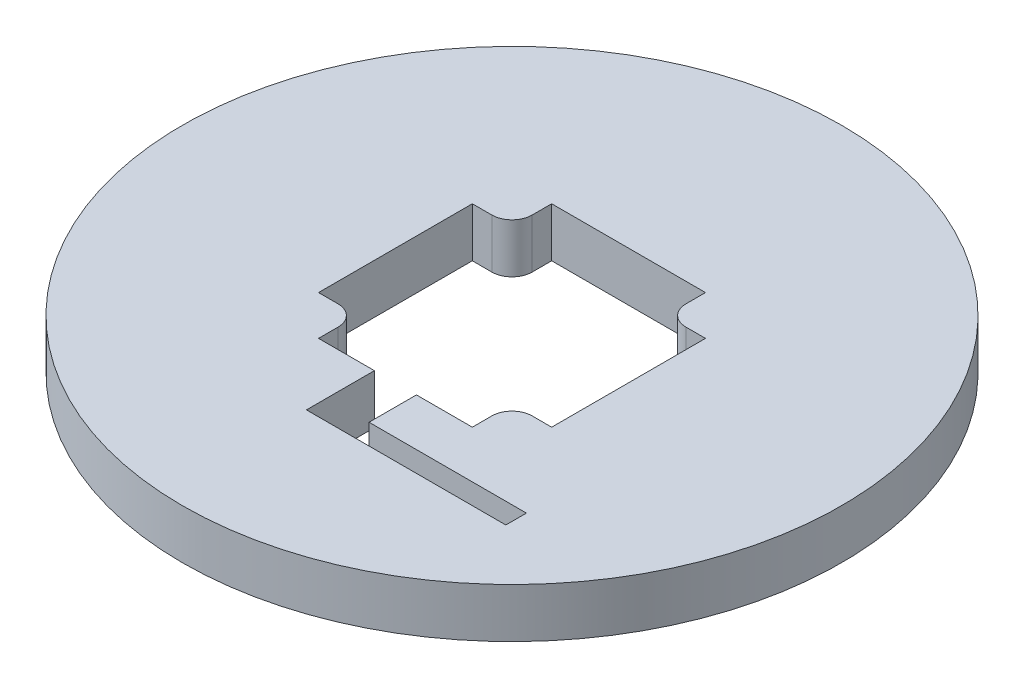
ISO-10303-21;
HEADER;
FILE_DESCRIPTION(('STEP AP214'),'2;1');
FILE_NAME('part.step','',(''),(''),'','','');
FILE_SCHEMA(('AUTOMOTIVE_DESIGN { 1 0 10303 214 1 1 1 1 }'));
ENDSEC;
DATA;
#1=APPLICATION_CONTEXT('core data for automotive mechanical design processes');
#2=APPLICATION_PROTOCOL_DEFINITION('international standard','automotive_design',2000,#1);
#3=PRODUCT_CONTEXT('',#1,'mechanical');
#4=PRODUCT('Part','Part','',(#3));
#5=PRODUCT_RELATED_PRODUCT_CATEGORY('part','',(#4));
#6=PRODUCT_DEFINITION_FORMATION('','',#4);
#7=PRODUCT_DEFINITION_CONTEXT('part definition',#1,'design');
#8=PRODUCT_DEFINITION('design','',#6,#7);
#9=PRODUCT_DEFINITION_SHAPE('','',#8);
#10=(LENGTH_UNIT() NAMED_UNIT(*) SI_UNIT(.MILLI.,.METRE.));
#11=(NAMED_UNIT(*) PLANE_ANGLE_UNIT() SI_UNIT($,.RADIAN.));
#12=(NAMED_UNIT(*) SI_UNIT($,.STERADIAN.) SOLID_ANGLE_UNIT());
#13=UNCERTAINTY_MEASURE_WITH_UNIT(LENGTH_MEASURE(1.E-05),#10,'distance_accuracy_value','');
#14=(GEOMETRIC_REPRESENTATION_CONTEXT(3) GLOBAL_UNCERTAINTY_ASSIGNED_CONTEXT((#13)) GLOBAL_UNIT_ASSIGNED_CONTEXT((#10,
#11,#12)) REPRESENTATION_CONTEXT('',''));
#15=CARTESIAN_POINT('',(0.,0.,0.));
#16=DIRECTION('',(0.,0.,1.));
#17=DIRECTION('',(1.,0.,0.));
#18=AXIS2_PLACEMENT_3D('',#15,#16,#17);
#19=CARTESIAN_POINT('',(-5.1,12.,29.8));
#20=DIRECTION('',(1.,0.,0.));
#21=DIRECTION('',(0.,0.,-1.));
#22=AXIS2_PLACEMENT_3D('',#19,#20,#21);
#23=PLANE('',#22);
#24=DIRECTION('',(0.,0.,1.));
#25=VECTOR('',#24,1.);
#26=CARTESIAN_POINT('',(-5.1,0.,29.8));
#27=LINE('',#26,#25);
#28=CARTESIAN_POINT('',(-5.1,0.,28.3));
#29=VERTEX_POINT('',#28);
#30=CARTESIAN_POINT('',(-5.1,0.,44.8));
#31=VERTEX_POINT('',#30);
#32=EDGE_CURVE('E129',#29,#31,#27,.T.);
#33=ORIENTED_EDGE('',*,*,#32,.F.);
#34=DIRECTION('',(0.,-1.,0.));
#35=VECTOR('',#34,1.);
#36=CARTESIAN_POINT('',(-5.1,12.,28.3));
#37=LINE('',#36,#35);
#38=CARTESIAN_POINT('',(-5.1,12.,28.3));
#39=VERTEX_POINT('',#38);
#40=EDGE_CURVE('E11',#39,#29,#37,.T.);
#41=ORIENTED_EDGE('',*,*,#40,.F.);
#42=DIRECTION('',(0.,0.,1.));
#43=VECTOR('',#42,1.);
#44=CARTESIAN_POINT('',(-5.1,12.,29.8));
#45=LINE('',#44,#43);
#46=CARTESIAN_POINT('',(-5.1,12.,44.8));
#47=VERTEX_POINT('',#46);
#48=EDGE_CURVE('E221',#39,#47,#45,.T.);
#49=ORIENTED_EDGE('',*,*,#48,.T.);
#50=DIRECTION('',(0.,-1.,0.));
#51=VECTOR('',#50,1.);
#52=CARTESIAN_POINT('',(-5.1,238.274169979695,44.8));
#53=LINE('',#52,#51);
#54=EDGE_CURVE('E372',#47,#31,#53,.T.);
#55=ORIENTED_EDGE('',*,*,#54,.T.);
#56=EDGE_LOOP('',(#33,#41,#49,#55));
#57=FACE_BOUND('',#56,.T.);
#58=ADVANCED_FACE('F44',(#57),#23,.T.);
#59=CARTESIAN_POINT('',(-5.1,12.,28.3));
#60=DIRECTION('',(0.,0.,-1.));
#61=DIRECTION('',(-1.,0.,0.));
#62=AXIS2_PLACEMENT_3D('',#59,#60,#61);
#63=PLANE('',#62);
#64=DIRECTION('',(1.,0.,0.));
#65=VECTOR('',#64,1.);
#66=CARTESIAN_POINT('',(-5.1,0.,28.3));
#67=LINE('',#66,#65);
#68=CARTESIAN_POINT('',(-18.67,0.,28.3));
#69=VERTEX_POINT('',#68);
#70=EDGE_CURVE('E294',#69,#29,#67,.T.);
#71=ORIENTED_EDGE('',*,*,#70,.F.);
#72=DIRECTION('',(0.,-1.,0.));
#73=VECTOR('',#72,1.);
#74=CARTESIAN_POINT('',(-18.67,12.,28.3));
#75=LINE('',#74,#73);
#76=CARTESIAN_POINT('',(-18.67,12.,28.3));
#77=VERTEX_POINT('',#76);
#78=EDGE_CURVE('E55',#77,#69,#75,.T.);
#79=ORIENTED_EDGE('',*,*,#78,.F.);
#80=DIRECTION('',(1.,0.,0.));
#81=VECTOR('',#80,1.);
#82=CARTESIAN_POINT('',(-5.1,12.,28.3));
#83=LINE('',#82,#81);
#84=EDGE_CURVE('E207',#77,#39,#83,.T.);
#85=ORIENTED_EDGE('',*,*,#84,.T.);
#86=ORIENTED_EDGE('',*,*,#40,.T.);
#87=EDGE_LOOP('',(#71,#79,#85,#86));
#88=FACE_BOUND('',#87,.T.);
#89=ADVANCED_FACE('F508',(#88),#63,.T.);
#90=CARTESIAN_POINT('',(-18.67,12.,28.3));
#91=DIRECTION('',(1.,0.,0.));
#92=DIRECTION('',(0.,0.,-1.));
#93=AXIS2_PLACEMENT_3D('',#90,#91,#92);
#94=PLANE('',#93);
#95=DIRECTION('',(0.,0.,1.));
#96=VECTOR('',#95,1.);
#97=CARTESIAN_POINT('',(-18.67,0.,28.3));
#98=LINE('',#97,#96);
#99=CARTESIAN_POINT('',(-18.67,0.,23.57));
#100=VERTEX_POINT('',#99);
#101=EDGE_CURVE('E189',#100,#69,#98,.T.);
#102=ORIENTED_EDGE('',*,*,#101,.F.);
#103=DIRECTION('',(0.,-1.,0.));
#104=VECTOR('',#103,1.);
#105=CARTESIAN_POINT('',(-18.67,12.,23.57));
#106=LINE('',#105,#104);
#107=CARTESIAN_POINT('',(-18.67,12.,23.57));
#108=VERTEX_POINT('',#107);
#109=EDGE_CURVE('E184',#108,#100,#106,.T.);
#110=ORIENTED_EDGE('',*,*,#109,.F.);
#111=DIRECTION('',(0.,0.,1.));
#112=VECTOR('',#111,1.);
#113=CARTESIAN_POINT('',(-18.67,12.,28.3));
#114=LINE('',#113,#112);
#115=EDGE_CURVE('E187',#108,#77,#114,.T.);
#116=ORIENTED_EDGE('',*,*,#115,.T.);
#117=ORIENTED_EDGE('',*,*,#78,.T.);
#118=EDGE_LOOP('',(#102,#110,#116,#117));
#119=FACE_BOUND('',#118,.T.);
#120=ADVANCED_FACE('F186',(#119),#94,.T.);
#121=CARTESIAN_POINT('',(-23.57,12.,23.57));
#122=DIRECTION('',(0.,-1.,0.));
#123=DIRECTION('',(0.,0.,-1.));
#124=AXIS2_PLACEMENT_3D('',#121,#122,#123);
#125=CYLINDRICAL_SURFACE('',#124,4.9);
#126=CARTESIAN_POINT('',(-23.57,0.,23.57));
#127=DIRECTION('',(0.,-1.,0.));
#128=DIRECTION('',(0.,0.,-1.));
#129=AXIS2_PLACEMENT_3D('',#126,#127,#128);
#130=CIRCLE('',#129,4.9);
#131=CARTESIAN_POINT('',(-23.57,0.,18.67));
#132=VERTEX_POINT('',#131);
#133=EDGE_CURVE('E289',#132,#100,#130,.T.);
#134=ORIENTED_EDGE('',*,*,#133,.F.);
#135=DIRECTION('',(0.,-1.,0.));
#136=VECTOR('',#135,1.);
#137=CARTESIAN_POINT('',(-23.57,12.,18.67));
#138=LINE('',#137,#136);
#139=CARTESIAN_POINT('',(-23.57,12.,18.67));
#140=VERTEX_POINT('',#139);
#141=EDGE_CURVE('E195',#140,#132,#138,.T.);
#142=ORIENTED_EDGE('',*,*,#141,.F.);
#143=CARTESIAN_POINT('',(-23.57,12.,23.57));
#144=DIRECTION('',(0.,-1.,0.));
#145=DIRECTION('',(0.,0.,-1.));
#146=AXIS2_PLACEMENT_3D('',#143,#144,#145);
#147=CIRCLE('',#146,4.9);
#148=EDGE_CURVE('E204',#140,#108,#147,.T.);
#149=ORIENTED_EDGE('',*,*,#148,.T.);
#150=ORIENTED_EDGE('',*,*,#109,.T.);
#151=EDGE_LOOP('',(#134,#142,#149,#150));
#152=FACE_BOUND('',#151,.T.);
#153=ADVANCED_FACE('F210',(#152),#125,.T.);
#154=CARTESIAN_POINT('',(-23.57,12.,18.67));
#155=DIRECTION('',(0.,0.,-1.));
#156=DIRECTION('',(-1.,0.,0.));
#157=AXIS2_PLACEMENT_3D('',#154,#155,#156);
#158=PLANE('',#157);
#159=DIRECTION('',(1.,0.,0.));
#160=VECTOR('',#159,1.);
#161=CARTESIAN_POINT('',(-23.57,0.,18.67));
#162=LINE('',#161,#160);
#163=CARTESIAN_POINT('',(-28.3,0.,18.67));
#164=VERTEX_POINT('',#163);
#165=EDGE_CURVE('E285',#164,#132,#162,.T.);
#166=ORIENTED_EDGE('',*,*,#165,.F.);
#167=DIRECTION('',(0.,-1.,0.));
#168=VECTOR('',#167,1.);
#169=CARTESIAN_POINT('',(-28.3,12.,18.67));
#170=LINE('',#169,#168);
#171=CARTESIAN_POINT('',(-28.3,12.,18.67));
#172=VERTEX_POINT('',#171);
#173=EDGE_CURVE('E305',#172,#164,#170,.T.);
#174=ORIENTED_EDGE('',*,*,#173,.F.);
#175=DIRECTION('',(1.,0.,0.));
#176=VECTOR('',#175,1.);
#177=CARTESIAN_POINT('',(-23.57,12.,18.67));
#178=LINE('',#177,#176);
#179=EDGE_CURVE('E212',#172,#140,#178,.T.);
#180=ORIENTED_EDGE('',*,*,#179,.T.);
#181=ORIENTED_EDGE('',*,*,#141,.T.);
#182=EDGE_LOOP('',(#166,#174,#180,#181));
#183=FACE_BOUND('',#182,.T.);
#184=ADVANCED_FACE('F522',(#183),#158,.T.);
#185=CARTESIAN_POINT('',(-28.3,12.,18.67));
#186=DIRECTION('',(1.,0.,0.));
#187=DIRECTION('',(0.,0.,-1.));
#188=AXIS2_PLACEMENT_3D('',#185,#186,#187);
#189=PLANE('',#188);
#190=DIRECTION('',(0.,0.,1.));
#191=VECTOR('',#190,1.);
#192=CARTESIAN_POINT('',(-28.3,0.,18.67));
#193=LINE('',#192,#191);
#194=CARTESIAN_POINT('',(-28.3,0.,-18.67));
#195=VERTEX_POINT('',#194);
#196=EDGE_CURVE('E281',#195,#164,#193,.T.);
#197=ORIENTED_EDGE('',*,*,#196,.F.);
#198=DIRECTION('',(0.,-1.,0.));
#199=VECTOR('',#198,1.);
#200=CARTESIAN_POINT('',(-28.3,12.,-18.67));
#201=LINE('',#200,#199);
#202=CARTESIAN_POINT('',(-28.3,12.,-18.67));
#203=VERTEX_POINT('',#202);
#204=EDGE_CURVE('E308',#203,#195,#201,.T.);
#205=ORIENTED_EDGE('',*,*,#204,.F.);
#206=DIRECTION('',(0.,0.,1.));
#207=VECTOR('',#206,1.);
#208=CARTESIAN_POINT('',(-28.3,12.,18.67));
#209=LINE('',#208,#207);
#210=EDGE_CURVE('E215',#203,#172,#209,.T.);
#211=ORIENTED_EDGE('',*,*,#210,.T.);
#212=ORIENTED_EDGE('',*,*,#173,.T.);
#213=EDGE_LOOP('',(#197,#205,#211,#212));
#214=FACE_BOUND('',#213,.T.);
#215=ADVANCED_FACE('F449',(#214),#189,.T.);
#216=CARTESIAN_POINT('',(-28.3,12.,-18.67));
#217=DIRECTION('',(0.,0.,1.));
#218=DIRECTION('',(1.,0.,0.));
#219=AXIS2_PLACEMENT_3D('',#216,#217,#218);
#220=PLANE('',#219);
#221=DIRECTION('',(-1.,0.,0.));
#222=VECTOR('',#221,1.);
#223=CARTESIAN_POINT('',(-28.3,0.,-18.67));
#224=LINE('',#223,#222);
#225=CARTESIAN_POINT('',(-23.57,0.,-18.67));
#226=VERTEX_POINT('',#225);
#227=EDGE_CURVE('E277',#226,#195,#224,.T.);
#228=ORIENTED_EDGE('',*,*,#227,.F.);
#229=DIRECTION('',(0.,-1.,0.));
#230=VECTOR('',#229,1.);
#231=CARTESIAN_POINT('',(-23.57,12.,-18.67));
#232=LINE('',#231,#230);
#233=CARTESIAN_POINT('',(-23.57,12.,-18.67));
#234=VERTEX_POINT('',#233);
#235=EDGE_CURVE('E311',#234,#226,#232,.T.);
#236=ORIENTED_EDGE('',*,*,#235,.F.);
#237=DIRECTION('',(-1.,0.,0.));
#238=VECTOR('',#237,1.);
#239=CARTESIAN_POINT('',(-28.3,12.,-18.67));
#240=LINE('',#239,#238);
#241=EDGE_CURVE('E441',#234,#203,#240,.T.);
#242=ORIENTED_EDGE('',*,*,#241,.T.);
#243=ORIENTED_EDGE('',*,*,#204,.T.);
#244=EDGE_LOOP('',(#228,#236,#242,#243));
#245=FACE_BOUND('',#244,.T.);
#246=ADVANCED_FACE('F455',(#245),#220,.T.);
#247=CARTESIAN_POINT('',(-23.57,12.,-23.57));
#248=DIRECTION('',(0.,-1.,0.));
#249=DIRECTION('',(0.,0.,-1.));
#250=AXIS2_PLACEMENT_3D('',#247,#248,#249);
#251=CYLINDRICAL_SURFACE('',#250,4.9);
#252=CARTESIAN_POINT('',(-23.57,0.,-23.57));
#253=DIRECTION('',(0.,-1.,0.));
#254=DIRECTION('',(0.,0.,-1.));
#255=AXIS2_PLACEMENT_3D('',#252,#253,#254);
#256=CIRCLE('',#255,4.9);
#257=CARTESIAN_POINT('',(-18.67,0.,-23.57));
#258=VERTEX_POINT('',#257);
#259=EDGE_CURVE('E273',#258,#226,#256,.T.);
#260=ORIENTED_EDGE('',*,*,#259,.F.);
#261=DIRECTION('',(0.,-1.,0.));
#262=VECTOR('',#261,1.);
#263=CARTESIAN_POINT('',(-18.67,12.,-23.57));
#264=LINE('',#263,#262);
#265=CARTESIAN_POINT('',(-18.67,12.,-23.57));
#266=VERTEX_POINT('',#265);
#267=EDGE_CURVE('E314',#266,#258,#264,.T.);
#268=ORIENTED_EDGE('',*,*,#267,.F.);
#269=CARTESIAN_POINT('',(-23.57,12.,-23.57));
#270=DIRECTION('',(0.,-1.,0.));
#271=DIRECTION('',(0.,0.,-1.));
#272=AXIS2_PLACEMENT_3D('',#269,#270,#271);
#273=CIRCLE('',#272,4.9);
#274=EDGE_CURVE('E437',#266,#234,#273,.T.);
#275=ORIENTED_EDGE('',*,*,#274,.T.);
#276=ORIENTED_EDGE('',*,*,#235,.T.);
#277=EDGE_LOOP('',(#260,#268,#275,#276));
#278=FACE_BOUND('',#277,.T.);
#279=ADVANCED_FACE('F458',(#278),#251,.T.);
#280=CARTESIAN_POINT('',(-18.67,12.,-23.57));
#281=DIRECTION('',(1.,0.,0.));
#282=DIRECTION('',(0.,0.,-1.));
#283=AXIS2_PLACEMENT_3D('',#280,#281,#282);
#284=PLANE('',#283);
#285=DIRECTION('',(0.,0.,1.));
#286=VECTOR('',#285,1.);
#287=CARTESIAN_POINT('',(-18.67,0.,-23.57));
#288=LINE('',#287,#286);
#289=CARTESIAN_POINT('',(-18.67,0.,-28.3));
#290=VERTEX_POINT('',#289);
#291=EDGE_CURVE('E269',#290,#258,#288,.T.);
#292=ORIENTED_EDGE('',*,*,#291,.F.);
#293=DIRECTION('',(0.,-1.,0.));
#294=VECTOR('',#293,1.);
#295=CARTESIAN_POINT('',(-18.67,12.,-28.3));
#296=LINE('',#295,#294);
#297=CARTESIAN_POINT('',(-18.67,12.,-28.3));
#298=VERTEX_POINT('',#297);
#299=EDGE_CURVE('E317',#298,#290,#296,.T.);
#300=ORIENTED_EDGE('',*,*,#299,.F.);
#301=DIRECTION('',(0.,0.,1.));
#302=VECTOR('',#301,1.);
#303=CARTESIAN_POINT('',(-18.67,12.,-23.57));
#304=LINE('',#303,#302);
#305=EDGE_CURVE('E433',#298,#266,#304,.T.);
#306=ORIENTED_EDGE('',*,*,#305,.T.);
#307=ORIENTED_EDGE('',*,*,#267,.T.);
#308=EDGE_LOOP('',(#292,#300,#306,#307));
#309=FACE_BOUND('',#308,.T.);
#310=ADVANCED_FACE('F463',(#309),#284,.T.);
#311=CARTESIAN_POINT('',(-18.67,12.,-28.3));
#312=DIRECTION('',(0.,0.,1.));
#313=DIRECTION('',(1.,0.,0.));
#314=AXIS2_PLACEMENT_3D('',#311,#312,#313);
#315=PLANE('',#314);
#316=DIRECTION('',(-1.,0.,0.));
#317=VECTOR('',#316,1.);
#318=CARTESIAN_POINT('',(-18.67,0.,-28.3));
#319=LINE('',#318,#317);
#320=CARTESIAN_POINT('',(18.67,0.,-28.3));
#321=VERTEX_POINT('',#320);
#322=EDGE_CURVE('E265',#321,#290,#319,.T.);
#323=ORIENTED_EDGE('',*,*,#322,.F.);
#324=DIRECTION('',(0.,-1.,0.));
#325=VECTOR('',#324,1.);
#326=CARTESIAN_POINT('',(18.67,12.,-28.3));
#327=LINE('',#326,#325);
#328=CARTESIAN_POINT('',(18.67,12.,-28.3));
#329=VERTEX_POINT('',#328);
#330=EDGE_CURVE('E320',#329,#321,#327,.T.);
#331=ORIENTED_EDGE('',*,*,#330,.F.);
#332=DIRECTION('',(-1.,0.,0.));
#333=VECTOR('',#332,1.);
#334=CARTESIAN_POINT('',(-18.67,12.,-28.3));
#335=LINE('',#334,#333);
#336=EDGE_CURVE('E429',#329,#298,#335,.T.);
#337=ORIENTED_EDGE('',*,*,#336,.T.);
#338=ORIENTED_EDGE('',*,*,#299,.T.);
#339=EDGE_LOOP('',(#323,#331,#337,#338));
#340=FACE_BOUND('',#339,.T.);
#341=ADVANCED_FACE('F466',(#340),#315,.T.);
#342=CARTESIAN_POINT('',(18.67,12.,-28.3));
#343=DIRECTION('',(-1.,0.,0.));
#344=DIRECTION('',(0.,0.,1.));
#345=AXIS2_PLACEMENT_3D('',#342,#343,#344);
#346=PLANE('',#345);
#347=DIRECTION('',(0.,0.,-1.));
#348=VECTOR('',#347,1.);
#349=CARTESIAN_POINT('',(18.67,0.,-28.3));
#350=LINE('',#349,#348);
#351=CARTESIAN_POINT('',(18.67,0.,-23.57));
#352=VERTEX_POINT('',#351);
#353=EDGE_CURVE('E261',#352,#321,#350,.T.);
#354=ORIENTED_EDGE('',*,*,#353,.F.);
#355=DIRECTION('',(0.,-1.,0.));
#356=VECTOR('',#355,1.);
#357=CARTESIAN_POINT('',(18.67,12.,-23.57));
#358=LINE('',#357,#356);
#359=CARTESIAN_POINT('',(18.67,12.,-23.57));
#360=VERTEX_POINT('',#359);
#361=EDGE_CURVE('E323',#360,#352,#358,.T.);
#362=ORIENTED_EDGE('',*,*,#361,.F.);
#363=DIRECTION('',(0.,0.,-1.));
#364=VECTOR('',#363,1.);
#365=CARTESIAN_POINT('',(18.67,12.,-28.3));
#366=LINE('',#365,#364);
#367=EDGE_CURVE('E425',#360,#329,#366,.T.);
#368=ORIENTED_EDGE('',*,*,#367,.T.);
#369=ORIENTED_EDGE('',*,*,#330,.T.);
#370=EDGE_LOOP('',(#354,#362,#368,#369));
#371=FACE_BOUND('',#370,.T.);
#372=ADVANCED_FACE('F471',(#371),#346,.T.);
#373=CARTESIAN_POINT('',(23.57,12.,-23.57));
#374=DIRECTION('',(0.,-1.,0.));
#375=DIRECTION('',(0.,0.,-1.));
#376=AXIS2_PLACEMENT_3D('',#373,#374,#375);
#377=CYLINDRICAL_SURFACE('',#376,4.9);
#378=CARTESIAN_POINT('',(23.57,0.,-23.57));
#379=DIRECTION('',(0.,-1.,0.));
#380=DIRECTION('',(0.,0.,-1.));
#381=AXIS2_PLACEMENT_3D('',#378,#379,#380);
#382=CIRCLE('',#381,4.9);
#383=CARTESIAN_POINT('',(23.57,0.,-18.67));
#384=VERTEX_POINT('',#383);
#385=EDGE_CURVE('E257',#384,#352,#382,.T.);
#386=ORIENTED_EDGE('',*,*,#385,.F.);
#387=DIRECTION('',(0.,-1.,0.));
#388=VECTOR('',#387,1.);
#389=CARTESIAN_POINT('',(23.57,12.,-18.67));
#390=LINE('',#389,#388);
#391=CARTESIAN_POINT('',(23.57,12.,-18.67));
#392=VERTEX_POINT('',#391);
#393=EDGE_CURVE('E326',#392,#384,#390,.T.);
#394=ORIENTED_EDGE('',*,*,#393,.F.);
#395=CARTESIAN_POINT('',(23.57,12.,-23.57));
#396=DIRECTION('',(0.,-1.,0.));
#397=DIRECTION('',(0.,0.,-1.));
#398=AXIS2_PLACEMENT_3D('',#395,#396,#397);
#399=CIRCLE('',#398,4.9);
#400=EDGE_CURVE('E421',#392,#360,#399,.T.);
#401=ORIENTED_EDGE('',*,*,#400,.T.);
#402=ORIENTED_EDGE('',*,*,#361,.T.);
#403=EDGE_LOOP('',(#386,#394,#401,#402));
#404=FACE_BOUND('',#403,.T.);
#405=ADVANCED_FACE('F474',(#404),#377,.T.);
#406=CARTESIAN_POINT('',(23.57,12.,-18.67));
#407=DIRECTION('',(0.,0.,1.));
#408=DIRECTION('',(1.,0.,0.));
#409=AXIS2_PLACEMENT_3D('',#406,#407,#408);
#410=PLANE('',#409);
#411=DIRECTION('',(-1.,0.,0.));
#412=VECTOR('',#411,1.);
#413=CARTESIAN_POINT('',(23.57,0.,-18.67));
#414=LINE('',#413,#412);
#415=CARTESIAN_POINT('',(28.3,0.,-18.67));
#416=VERTEX_POINT('',#415);
#417=EDGE_CURVE('E253',#416,#384,#414,.T.);
#418=ORIENTED_EDGE('',*,*,#417,.F.);
#419=DIRECTION('',(0.,-1.,0.));
#420=VECTOR('',#419,1.);
#421=CARTESIAN_POINT('',(28.3,12.,-18.67));
#422=LINE('',#421,#420);
#423=CARTESIAN_POINT('',(28.3,12.,-18.67));
#424=VERTEX_POINT('',#423);
#425=EDGE_CURVE('E329',#424,#416,#422,.T.);
#426=ORIENTED_EDGE('',*,*,#425,.F.);
#427=DIRECTION('',(-1.,0.,0.));
#428=VECTOR('',#427,1.);
#429=CARTESIAN_POINT('',(23.57,12.,-18.67));
#430=LINE('',#429,#428);
#431=EDGE_CURVE('E417',#424,#392,#430,.T.);
#432=ORIENTED_EDGE('',*,*,#431,.T.);
#433=ORIENTED_EDGE('',*,*,#393,.T.);
#434=EDGE_LOOP('',(#418,#426,#432,#433));
#435=FACE_BOUND('',#434,.T.);
#436=ADVANCED_FACE('F479',(#435),#410,.T.);
#437=CARTESIAN_POINT('',(28.3,12.,-18.67));
#438=DIRECTION('',(-1.,0.,0.));
#439=DIRECTION('',(0.,0.,1.));
#440=AXIS2_PLACEMENT_3D('',#437,#438,#439);
#441=PLANE('',#440);
#442=DIRECTION('',(0.,0.,-1.));
#443=VECTOR('',#442,1.);
#444=CARTESIAN_POINT('',(28.3,0.,-18.67));
#445=LINE('',#444,#443);
#446=CARTESIAN_POINT('',(28.3,0.,18.67));
#447=VERTEX_POINT('',#446);
#448=EDGE_CURVE('E249',#447,#416,#445,.T.);
#449=ORIENTED_EDGE('',*,*,#448,.F.);
#450=DIRECTION('',(0.,-1.,0.));
#451=VECTOR('',#450,1.);
#452=CARTESIAN_POINT('',(28.3,12.,18.67));
#453=LINE('',#452,#451);
#454=CARTESIAN_POINT('',(28.3,12.,18.67));
#455=VERTEX_POINT('',#454);
#456=EDGE_CURVE('E332',#455,#447,#453,.T.);
#457=ORIENTED_EDGE('',*,*,#456,.F.);
#458=DIRECTION('',(0.,0.,-1.));
#459=VECTOR('',#458,1.);
#460=CARTESIAN_POINT('',(28.3,12.,-18.67));
#461=LINE('',#460,#459);
#462=EDGE_CURVE('E413',#455,#424,#461,.T.);
#463=ORIENTED_EDGE('',*,*,#462,.T.);
#464=ORIENTED_EDGE('',*,*,#425,.T.);
#465=EDGE_LOOP('',(#449,#457,#463,#464));
#466=FACE_BOUND('',#465,.T.);
#467=ADVANCED_FACE('F482',(#466),#441,.T.);
#468=CARTESIAN_POINT('',(28.3,12.,18.67));
#469=DIRECTION('',(0.,0.,-1.));
#470=DIRECTION('',(-1.,0.,0.));
#471=AXIS2_PLACEMENT_3D('',#468,#469,#470);
#472=PLANE('',#471);
#473=DIRECTION('',(1.,0.,0.));
#474=VECTOR('',#473,1.);
#475=CARTESIAN_POINT('',(28.3,0.,18.67));
#476=LINE('',#475,#474);
#477=CARTESIAN_POINT('',(23.57,0.,18.67));
#478=VERTEX_POINT('',#477);
#479=EDGE_CURVE('E245',#478,#447,#476,.T.);
#480=ORIENTED_EDGE('',*,*,#479,.F.);
#481=DIRECTION('',(0.,-1.,0.));
#482=VECTOR('',#481,1.);
#483=CARTESIAN_POINT('',(23.57,12.,18.67));
#484=LINE('',#483,#482);
#485=CARTESIAN_POINT('',(23.57,12.,18.67));
#486=VERTEX_POINT('',#485);
#487=EDGE_CURVE('E335',#486,#478,#484,.T.);
#488=ORIENTED_EDGE('',*,*,#487,.F.);
#489=DIRECTION('',(1.,0.,0.));
#490=VECTOR('',#489,1.);
#491=CARTESIAN_POINT('',(28.3,12.,18.67));
#492=LINE('',#491,#490);
#493=EDGE_CURVE('E409',#486,#455,#492,.T.);
#494=ORIENTED_EDGE('',*,*,#493,.T.);
#495=ORIENTED_EDGE('',*,*,#456,.T.);
#496=EDGE_LOOP('',(#480,#488,#494,#495));
#497=FACE_BOUND('',#496,.T.);
#498=ADVANCED_FACE('F487',(#497),#472,.T.);
#499=CARTESIAN_POINT('',(23.57,12.,23.57));
#500=DIRECTION('',(0.,-1.,0.));
#501=DIRECTION('',(0.,0.,-1.));
#502=AXIS2_PLACEMENT_3D('',#499,#500,#501);
#503=CYLINDRICAL_SURFACE('',#502,4.9);
#504=CARTESIAN_POINT('',(23.57,0.,23.57));
#505=DIRECTION('',(0.,-1.,0.));
#506=DIRECTION('',(0.,0.,-1.));
#507=AXIS2_PLACEMENT_3D('',#504,#505,#506);
#508=CIRCLE('',#507,4.9);
#509=CARTESIAN_POINT('',(18.67,0.,23.57));
#510=VERTEX_POINT('',#509);
#511=EDGE_CURVE('E241',#510,#478,#508,.T.);
#512=ORIENTED_EDGE('',*,*,#511,.F.);
#513=DIRECTION('',(0.,-1.,0.));
#514=VECTOR('',#513,1.);
#515=CARTESIAN_POINT('',(18.67,12.,23.57));
#516=LINE('',#515,#514);
#517=CARTESIAN_POINT('',(18.67,12.,23.57));
#518=VERTEX_POINT('',#517);
#519=EDGE_CURVE('E338',#518,#510,#516,.T.);
#520=ORIENTED_EDGE('',*,*,#519,.F.);
#521=CARTESIAN_POINT('',(23.57,12.,23.57));
#522=DIRECTION('',(0.,-1.,0.));
#523=DIRECTION('',(0.,0.,-1.));
#524=AXIS2_PLACEMENT_3D('',#521,#522,#523);
#525=CIRCLE('',#524,4.9);
#526=EDGE_CURVE('E405',#518,#486,#525,.T.);
#527=ORIENTED_EDGE('',*,*,#526,.T.);
#528=ORIENTED_EDGE('',*,*,#487,.T.);
#529=EDGE_LOOP('',(#512,#520,#527,#528));
#530=FACE_BOUND('',#529,.T.);
#531=ADVANCED_FACE('F490',(#530),#503,.T.);
#532=CARTESIAN_POINT('',(18.67,12.,23.57));
#533=DIRECTION('',(-1.,0.,0.));
#534=DIRECTION('',(0.,0.,1.));
#535=AXIS2_PLACEMENT_3D('',#532,#533,#534);
#536=PLANE('',#535);
#537=DIRECTION('',(0.,0.,-1.));
#538=VECTOR('',#537,1.);
#539=CARTESIAN_POINT('',(18.67,0.,23.57));
#540=LINE('',#539,#538);
#541=CARTESIAN_POINT('',(18.67,0.,28.3));
#542=VERTEX_POINT('',#541);
#543=EDGE_CURVE('E237',#542,#510,#540,.T.);
#544=ORIENTED_EDGE('',*,*,#543,.F.);
#545=DIRECTION('',(0.,-1.,0.));
#546=VECTOR('',#545,1.);
#547=CARTESIAN_POINT('',(18.67,12.,28.3));
#548=LINE('',#547,#546);
#549=CARTESIAN_POINT('',(18.67,12.,28.3));
#550=VERTEX_POINT('',#549);
#551=EDGE_CURVE('E341',#550,#542,#548,.T.);
#552=ORIENTED_EDGE('',*,*,#551,.F.);
#553=DIRECTION('',(0.,0.,-1.));
#554=VECTOR('',#553,1.);
#555=CARTESIAN_POINT('',(18.67,12.,23.57));
#556=LINE('',#555,#554);
#557=EDGE_CURVE('E401',#550,#518,#556,.T.);
#558=ORIENTED_EDGE('',*,*,#557,.T.);
#559=ORIENTED_EDGE('',*,*,#519,.T.);
#560=EDGE_LOOP('',(#544,#552,#558,#559));
#561=FACE_BOUND('',#560,.T.);
#562=ADVANCED_FACE('F495',(#561),#536,.T.);
#563=CARTESIAN_POINT('',(18.67,12.,28.3));
#564=DIRECTION('',(0.,0.,-1.));
#565=DIRECTION('',(-1.,0.,0.));
#566=AXIS2_PLACEMENT_3D('',#563,#564,#565);
#567=PLANE('',#566);
#568=DIRECTION('',(1.,0.,0.));
#569=VECTOR('',#568,1.);
#570=CARTESIAN_POINT('',(18.67,0.,28.3));
#571=LINE('',#570,#569);
#572=CARTESIAN_POINT('',(5.1,0.,28.3));
#573=VERTEX_POINT('',#572);
#574=EDGE_CURVE('E233',#573,#542,#571,.T.);
#575=ORIENTED_EDGE('',*,*,#574,.F.);
#576=DIRECTION('',(0.,-1.,0.));
#577=VECTOR('',#576,1.);
#578=CARTESIAN_POINT('',(5.1,12.,28.3));
#579=LINE('',#578,#577);
#580=CARTESIAN_POINT('',(5.1,12.,28.3));
#581=VERTEX_POINT('',#580);
#582=EDGE_CURVE('E343',#581,#573,#579,.T.);
#583=ORIENTED_EDGE('',*,*,#582,.F.);
#584=DIRECTION('',(1.,0.,0.));
#585=VECTOR('',#584,1.);
#586=CARTESIAN_POINT('',(18.67,12.,28.3));
#587=LINE('',#586,#585);
#588=EDGE_CURVE('E397',#581,#550,#587,.T.);
#589=ORIENTED_EDGE('',*,*,#588,.T.);
#590=ORIENTED_EDGE('',*,*,#551,.T.);
#591=EDGE_LOOP('',(#575,#583,#589,#590));
#592=FACE_BOUND('',#591,.T.);
#593=ADVANCED_FACE('F497',(#592),#567,.T.);
#594=CARTESIAN_POINT('',(5.1,12.,28.3));
#595=DIRECTION('',(-1.,0.,0.));
#596=DIRECTION('',(0.,0.,1.));
#597=AXIS2_PLACEMENT_3D('',#594,#595,#596);
#598=PLANE('',#597);
#599=DIRECTION('',(0.,0.,-1.));
#600=VECTOR('',#599,1.);
#601=CARTESIAN_POINT('',(5.1,0.,28.3));
#602=LINE('',#601,#600);
#603=CARTESIAN_POINT('',(5.1,0.,39.8));
#604=VERTEX_POINT('',#603);
#605=EDGE_CURVE('E228',#604,#573,#602,.T.);
#606=ORIENTED_EDGE('',*,*,#605,.F.);
#607=DIRECTION('',(0.,-1.,0.));
#608=VECTOR('',#607,1.);
#609=CARTESIAN_POINT('',(5.1,12.,39.8));
#610=LINE('',#609,#608);
#611=CARTESIAN_POINT('',(5.1,12.,39.8));
#612=VERTEX_POINT('',#611);
#613=EDGE_CURVE('E48',#612,#604,#610,.T.);
#614=ORIENTED_EDGE('',*,*,#613,.F.);
#615=DIRECTION('',(0.,0.,-1.));
#616=VECTOR('',#615,1.);
#617=CARTESIAN_POINT('',(5.1,12.,29.8));
#618=LINE('',#617,#616);
#619=EDGE_CURVE('E394',#612,#581,#618,.T.);
#620=ORIENTED_EDGE('',*,*,#619,.T.);
#621=ORIENTED_EDGE('',*,*,#582,.T.);
#622=EDGE_LOOP('',(#606,#614,#620,#621));
#623=FACE_BOUND('',#622,.T.);
#624=ADVANCED_FACE('F500',(#623),#598,.T.);
#625=CARTESIAN_POINT('',(15.1,12.,39.8));
#626=DIRECTION('',(0.,0.,1.));
#627=DIRECTION('',(1.,0.,0.));
#628=AXIS2_PLACEMENT_3D('',#625,#626,#627);
#629=PLANE('',#628);
#630=DIRECTION('',(-1.,0.,0.));
#631=VECTOR('',#630,1.);
#632=CARTESIAN_POINT('',(15.1,0.,39.8));
#633=LINE('',#632,#631);
#634=CARTESIAN_POINT('',(43.3,0.,39.8));
#635=VERTEX_POINT('',#634);
#636=EDGE_CURVE('E224',#635,#604,#633,.T.);
#637=ORIENTED_EDGE('',*,*,#636,.F.);
#638=DIRECTION('',(0.,-1.,0.));
#639=VECTOR('',#638,1.);
#640=CARTESIAN_POINT('',(43.3,238.274169979695,39.8));
#641=LINE('',#640,#639);
#642=CARTESIAN_POINT('',(43.3,12.,39.8));
#643=VERTEX_POINT('',#642);
#644=EDGE_CURVE('E367',#643,#635,#641,.T.);
#645=ORIENTED_EDGE('',*,*,#644,.F.);
#646=DIRECTION('',(-1.,0.,0.));
#647=VECTOR('',#646,1.);
#648=CARTESIAN_POINT('',(15.1,12.,39.8));
#649=LINE('',#648,#647);
#650=EDGE_CURVE('E299',#643,#612,#649,.T.);
#651=ORIENTED_EDGE('',*,*,#650,.T.);
#652=ORIENTED_EDGE('',*,*,#613,.T.);
#653=EDGE_LOOP('',(#637,#645,#651,#652));
#654=FACE_BOUND('',#653,.T.);
#655=ADVANCED_FACE('F46',(#654),#629,.T.);
#656=CARTESIAN_POINT('',(23.57,12.,23.57));
#657=DIRECTION('',(0.,-1.,0.));
#658=DIRECTION('',(0.,0.,-1.));
#659=AXIS2_PLACEMENT_3D('',#656,#657,#658);
#660=PLANE('',#659);
#661=ORIENTED_EDGE('',*,*,#650,.F.);
#662=DIRECTION('',(0.,0.,-1.));
#663=VECTOR('',#662,1.);
#664=CARTESIAN_POINT('',(43.3,12.,0.));
#665=LINE('',#664,#663);
#666=CARTESIAN_POINT('',(43.3,12.,44.8));
#667=VERTEX_POINT('',#666);
#668=EDGE_CURVE('E374',#667,#643,#665,.T.);
#669=ORIENTED_EDGE('',*,*,#668,.F.);
#670=DIRECTION('',(-1.,0.,0.));
#671=VECTOR('',#670,1.);
#672=CARTESIAN_POINT('',(0.,12.,44.8));
#673=LINE('',#672,#671);
#674=EDGE_CURVE('E229',#667,#47,#673,.T.);
#675=ORIENTED_EDGE('',*,*,#674,.T.);
#676=ORIENTED_EDGE('',*,*,#48,.F.);
#677=ORIENTED_EDGE('',*,*,#84,.F.);
#678=ORIENTED_EDGE('',*,*,#115,.F.);
#679=ORIENTED_EDGE('',*,*,#148,.F.);
#680=ORIENTED_EDGE('',*,*,#179,.F.);
#681=ORIENTED_EDGE('',*,*,#210,.F.);
#682=ORIENTED_EDGE('',*,*,#241,.F.);
#683=ORIENTED_EDGE('',*,*,#274,.F.);
#684=ORIENTED_EDGE('',*,*,#305,.F.);
#685=ORIENTED_EDGE('',*,*,#336,.F.);
#686=ORIENTED_EDGE('',*,*,#367,.F.);
#687=ORIENTED_EDGE('',*,*,#400,.F.);
#688=ORIENTED_EDGE('',*,*,#431,.F.);
#689=ORIENTED_EDGE('',*,*,#462,.F.);
#690=ORIENTED_EDGE('',*,*,#493,.F.);
#691=ORIENTED_EDGE('',*,*,#526,.F.);
#692=ORIENTED_EDGE('',*,*,#557,.F.);
#693=ORIENTED_EDGE('',*,*,#588,.F.);
#694=ORIENTED_EDGE('',*,*,#619,.F.);
#695=EDGE_LOOP('',(#661,#669,#675,#676,#677,#678,#679,#680,#681,#682,#683,#684,#685,#686,#687,
#688,#689,#690,#691,#692,#693,#694));
#696=FACE_BOUND('',#695,.T.);
#697=CARTESIAN_POINT('',(0.,12.,-1.29753373173189E-13));
#698=DIRECTION('',(0.,-1.,0.));
#699=DIRECTION('',(0.,0.,-1.));
#700=AXIS2_PLACEMENT_3D('',#697,#698,#699);
#701=CIRCLE('',#700,80.);
#702=CARTESIAN_POINT('',(0.,12.,-80.0000000000001));
#703=VERTEX_POINT('',#702);
#704=EDGE_CURVE('E387',#703,#703,#701,.F.);
#705=ORIENTED_EDGE('',*,*,#704,.T.);
#706=EDGE_LOOP('',(#705));
#707=FACE_BOUND('',#706,.T.);
#708=ADVANCED_FACE('F201',(#696,#707),#660,.F.);
#709=CARTESIAN_POINT('',(23.57,0.,23.57));
#710=DIRECTION('',(0.,-1.,0.));
#711=DIRECTION('',(0.,0.,-1.));
#712=AXIS2_PLACEMENT_3D('',#709,#710,#711);
#713=PLANE('',#712);
#714=ORIENTED_EDGE('',*,*,#32,.T.);
#715=DIRECTION('',(1.,0.,0.));
#716=VECTOR('',#715,1.);
#717=CARTESIAN_POINT('',(0.,0.,44.8));
#718=LINE('',#717,#716);
#719=CARTESIAN_POINT('',(43.3,0.,44.8));
#720=VERTEX_POINT('',#719);
#721=EDGE_CURVE('E362',#31,#720,#718,.T.);
#722=ORIENTED_EDGE('',*,*,#721,.T.);
#723=DIRECTION('',(0.,0.,1.));
#724=VECTOR('',#723,1.);
#725=CARTESIAN_POINT('',(43.3,0.,0.));
#726=LINE('',#725,#724);
#727=EDGE_CURVE('E359',#635,#720,#726,.T.);
#728=ORIENTED_EDGE('',*,*,#727,.F.);
#729=ORIENTED_EDGE('',*,*,#636,.T.);
#730=ORIENTED_EDGE('',*,*,#605,.T.);
#731=ORIENTED_EDGE('',*,*,#574,.T.);
#732=ORIENTED_EDGE('',*,*,#543,.T.);
#733=ORIENTED_EDGE('',*,*,#511,.T.);
#734=ORIENTED_EDGE('',*,*,#479,.T.);
#735=ORIENTED_EDGE('',*,*,#448,.T.);
#736=ORIENTED_EDGE('',*,*,#417,.T.);
#737=ORIENTED_EDGE('',*,*,#385,.T.);
#738=ORIENTED_EDGE('',*,*,#353,.T.);
#739=ORIENTED_EDGE('',*,*,#322,.T.);
#740=ORIENTED_EDGE('',*,*,#291,.T.);
#741=ORIENTED_EDGE('',*,*,#259,.T.);
#742=ORIENTED_EDGE('',*,*,#227,.T.);
#743=ORIENTED_EDGE('',*,*,#196,.T.);
#744=ORIENTED_EDGE('',*,*,#165,.T.);
#745=ORIENTED_EDGE('',*,*,#133,.T.);
#746=ORIENTED_EDGE('',*,*,#101,.T.);
#747=ORIENTED_EDGE('',*,*,#70,.T.);
#748=EDGE_LOOP('',(#714,#722,#728,#729,#730,#731,#732,#733,#734,#735,#736,#737,#738,#739,#740,
#741,#742,#743,#744,#745,#746,#747));
#749=FACE_BOUND('',#748,.T.);
#750=CARTESIAN_POINT('',(0.,0.,-1.29753373173189E-13));
#751=DIRECTION('',(0.,-1.,0.));
#752=DIRECTION('',(0.,0.,-1.));
#753=AXIS2_PLACEMENT_3D('',#750,#751,#752);
#754=CIRCLE('',#753,80.);
#755=CARTESIAN_POINT('',(0.,0.,-80.0000000000001));
#756=VERTEX_POINT('',#755);
#757=EDGE_CURVE('E391',#756,#756,#754,.T.);
#758=ORIENTED_EDGE('',*,*,#757,.T.);
#759=EDGE_LOOP('',(#758));
#760=FACE_BOUND('',#759,.T.);
#761=ADVANCED_FACE('F355',(#749,#760),#713,.T.);
#762=CARTESIAN_POINT('',(43.3,238.274169979695,0.));
#763=DIRECTION('',(1.,0.,0.));
#764=DIRECTION('',(0.,0.,-1.));
#765=AXIS2_PLACEMENT_3D('',#762,#763,#764);
#766=PLANE('',#765);
#767=DIRECTION('',(0.,-1.,0.));
#768=VECTOR('',#767,1.);
#769=CARTESIAN_POINT('',(43.3,238.274169979695,44.8));
#770=LINE('',#769,#768);
#771=EDGE_CURVE('E366',#667,#720,#770,.T.);
#772=ORIENTED_EDGE('',*,*,#771,.F.);
#773=ORIENTED_EDGE('',*,*,#668,.T.);
#774=ORIENTED_EDGE('',*,*,#644,.T.);
#775=ORIENTED_EDGE('',*,*,#727,.T.);
#776=EDGE_LOOP('',(#772,#773,#774,#775));
#777=FACE_BOUND('',#776,.T.);
#778=ADVANCED_FACE('F593',(#777),#766,.F.);
#779=CARTESIAN_POINT('',(0.,238.274169979695,44.8));
#780=DIRECTION('',(0.,0.,-1.));
#781=DIRECTION('',(-1.,0.,0.));
#782=AXIS2_PLACEMENT_3D('',#779,#780,#781);
#783=PLANE('',#782);
#784=ORIENTED_EDGE('',*,*,#674,.F.);
#785=ORIENTED_EDGE('',*,*,#771,.T.);
#786=ORIENTED_EDGE('',*,*,#721,.F.);
#787=ORIENTED_EDGE('',*,*,#54,.F.);
#788=EDGE_LOOP('',(#784,#785,#786,#787));
#789=FACE_BOUND('',#788,.T.);
#790=ADVANCED_FACE('F601',(#789),#783,.T.);
#791=CARTESIAN_POINT('',(0.,238.274169979695,-1.29753373173189E-13));
#792=DIRECTION('',(0.,-1.,0.));
#793=DIRECTION('',(0.,0.,-1.));
#794=AXIS2_PLACEMENT_3D('',#791,#792,#793);
#795=CYLINDRICAL_SURFACE('',#794,80.);
#796=ORIENTED_EDGE('',*,*,#704,.F.);
#797=EDGE_LOOP('',(#796));
#798=FACE_BOUND('',#797,.T.);
#799=ORIENTED_EDGE('',*,*,#757,.F.);
#800=EDGE_LOOP('',(#799));
#801=FACE_BOUND('',#800,.T.);
#802=ADVANCED_FACE('F611',(#798,#801),#795,.T.);
#803=CLOSED_SHELL('',(#58,#89,#120,#153,#184,#215,#246,#279,#310,#341,#372,#405,#436,#467,#498,
#531,#562,#593,#624,#655,#708,#761,#778,#790,#802));
#804=MANIFOLD_SOLID_BREP('B2',#803);
#805=ADVANCED_BREP_SHAPE_REPRESENTATION('',(#18,#804),#14);
#806=SHAPE_DEFINITION_REPRESENTATION(#9,#805);
ENDSEC;
END-ISO-10303-21;
